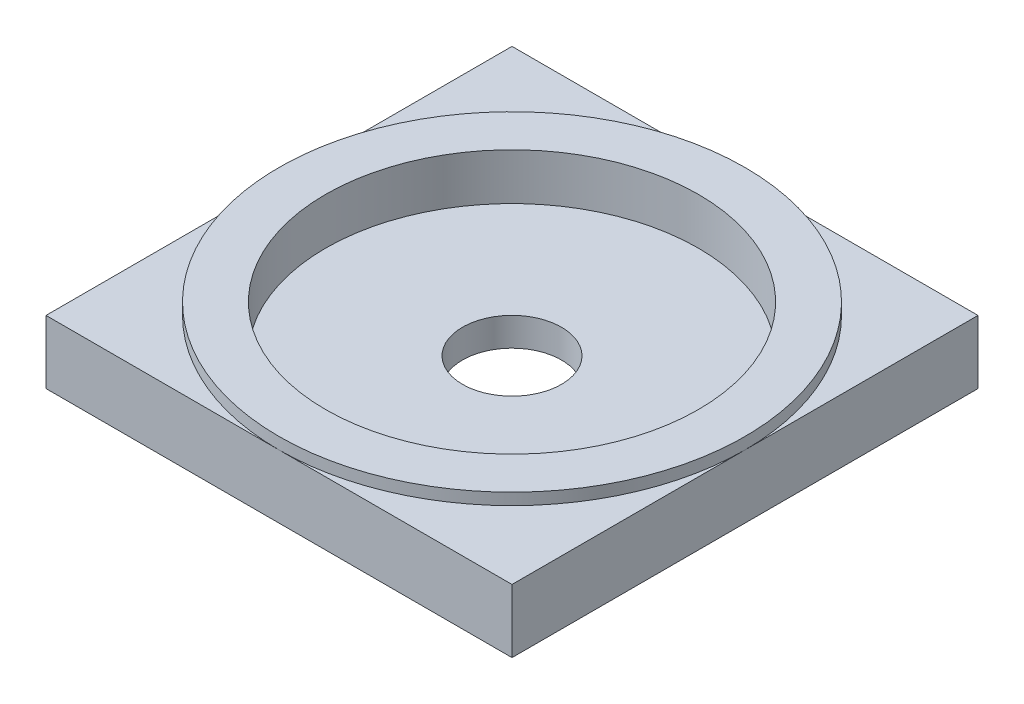
ISO-10303-21;
HEADER;
FILE_DESCRIPTION(('STEP AP214'),'2;1');
FILE_NAME('part.step','',(''),(''),'','','');
FILE_SCHEMA(('AUTOMOTIVE_DESIGN { 1 0 10303 214 1 1 1 1 }'));
ENDSEC;
DATA;
#1=APPLICATION_CONTEXT('core data for automotive mechanical design processes');
#2=APPLICATION_PROTOCOL_DEFINITION('international standard','automotive_design',2000,#1);
#3=PRODUCT_CONTEXT('',#1,'mechanical');
#4=PRODUCT('Part','Part','',(#3));
#5=PRODUCT_RELATED_PRODUCT_CATEGORY('part','',(#4));
#6=PRODUCT_DEFINITION_FORMATION('','',#4);
#7=PRODUCT_DEFINITION_CONTEXT('part definition',#1,'design');
#8=PRODUCT_DEFINITION('design','',#6,#7);
#9=PRODUCT_DEFINITION_SHAPE('','',#8);
#10=(LENGTH_UNIT() NAMED_UNIT(*) SI_UNIT(.MILLI.,.METRE.));
#11=(NAMED_UNIT(*) PLANE_ANGLE_UNIT() SI_UNIT($,.RADIAN.));
#12=(NAMED_UNIT(*) SI_UNIT($,.STERADIAN.) SOLID_ANGLE_UNIT());
#13=UNCERTAINTY_MEASURE_WITH_UNIT(LENGTH_MEASURE(1.E-05),#10,'distance_accuracy_value','');
#14=(GEOMETRIC_REPRESENTATION_CONTEXT(3) GLOBAL_UNCERTAINTY_ASSIGNED_CONTEXT((#13)) GLOBAL_UNIT_ASSIGNED_CONTEXT((#10,
#11,#12)) REPRESENTATION_CONTEXT('',''));
#15=CARTESIAN_POINT('',(0.,0.,0.));
#16=DIRECTION('',(0.,0.,1.));
#17=DIRECTION('',(1.,0.,0.));
#18=AXIS2_PLACEMENT_3D('',#15,#16,#17);
#19=CARTESIAN_POINT('',(0.,0.,0.));
#20=DIRECTION('',(0.,1.,0.));
#21=DIRECTION('',(0.,0.,1.));
#22=AXIS2_PLACEMENT_3D('',#19,#20,#21);
#23=PLANE('',#22);
#24=CARTESIAN_POINT('',(0.,0.,0.));
#25=DIRECTION('',(0.,1.,0.));
#26=DIRECTION('',(0.,0.,1.));
#27=AXIS2_PLACEMENT_3D('',#24,#25,#26);
#28=CIRCLE('',#27,31.75);
#29=CARTESIAN_POINT('',(0.,0.,31.75));
#30=VERTEX_POINT('',#29);
#31=CARTESIAN_POINT('',(31.75,0.,0.));
#32=VERTEX_POINT('',#31);
#33=EDGE_CURVE('E43',#30,#32,#28,.T.);
#34=ORIENTED_EDGE('',*,*,#33,.F.);
#35=DIRECTION('',(1.,0.,0.));
#36=VECTOR('',#35,1.);
#37=CARTESIAN_POINT('',(-31.75,0.,31.75));
#38=LINE('',#37,#36);
#39=CARTESIAN_POINT('',(31.75,0.,31.75));
#40=VERTEX_POINT('',#39);
#41=EDGE_CURVE('E93',#30,#40,#38,.T.);
#42=ORIENTED_EDGE('',*,*,#41,.T.);
#43=DIRECTION('',(0.,0.,-1.));
#44=VECTOR('',#43,1.);
#45=CARTESIAN_POINT('',(31.75,0.,-31.75));
#46=LINE('',#45,#44);
#47=EDGE_CURVE('E105',#40,#32,#46,.T.);
#48=ORIENTED_EDGE('',*,*,#47,.T.);
#49=EDGE_LOOP('',(#34,#42,#48));
#50=FACE_BOUND('',#49,.T.);
#51=ADVANCED_FACE('F32',(#50),#23,.T.);
#52=CARTESIAN_POINT('',(0.,0.,-31.75));
#53=VERTEX_POINT('',#52);
#54=EDGE_CURVE('E11',#32,#53,#28,.T.);
#55=ORIENTED_EDGE('',*,*,#54,.F.);
#56=CARTESIAN_POINT('',(31.75,0.,-31.75));
#57=VERTEX_POINT('',#56);
#58=EDGE_CURVE('E127',#32,#57,#46,.T.);
#59=ORIENTED_EDGE('',*,*,#58,.T.);
#60=DIRECTION('',(-1.,0.,0.));
#61=VECTOR('',#60,1.);
#62=CARTESIAN_POINT('',(-31.75,0.,-31.75));
#63=LINE('',#62,#61);
#64=EDGE_CURVE('E128',#57,#53,#63,.T.);
#65=ORIENTED_EDGE('',*,*,#64,.T.);
#66=EDGE_LOOP('',(#55,#59,#65));
#67=FACE_BOUND('',#66,.T.);
#68=ADVANCED_FACE('F144',(#67),#23,.T.);
#69=CARTESIAN_POINT('',(-31.75,0.,0.));
#70=VERTEX_POINT('',#69);
#71=EDGE_CURVE('E41',#53,#70,#28,.T.);
#72=ORIENTED_EDGE('',*,*,#71,.F.);
#73=CARTESIAN_POINT('',(-31.75,0.,-31.75));
#74=VERTEX_POINT('',#73);
#75=EDGE_CURVE('E126',#53,#74,#63,.T.);
#76=ORIENTED_EDGE('',*,*,#75,.T.);
#77=DIRECTION('',(0.,0.,1.));
#78=VECTOR('',#77,1.);
#79=CARTESIAN_POINT('',(-31.75,0.,-31.75));
#80=LINE('',#79,#78);
#81=EDGE_CURVE('E103',#74,#70,#80,.T.);
#82=ORIENTED_EDGE('',*,*,#81,.T.);
#83=EDGE_LOOP('',(#72,#76,#82));
#84=FACE_BOUND('',#83,.T.);
#85=ADVANCED_FACE('F161',(#84),#23,.T.);
#86=CARTESIAN_POINT('',(31.75,-8.636,-31.75));
#87=DIRECTION('',(1.,0.,0.));
#88=DIRECTION('',(0.,0.,-1.));
#89=AXIS2_PLACEMENT_3D('',#86,#87,#88);
#90=PLANE('',#89);
#91=ORIENTED_EDGE('',*,*,#47,.F.);
#92=DIRECTION('',(0.,1.,0.));
#93=VECTOR('',#92,1.);
#94=CARTESIAN_POINT('',(31.75,-8.636,31.75));
#95=LINE('',#94,#93);
#96=CARTESIAN_POINT('',(31.75,-8.636,31.75));
#97=VERTEX_POINT('',#96);
#98=EDGE_CURVE('E99',#97,#40,#95,.T.);
#99=ORIENTED_EDGE('',*,*,#98,.F.);
#100=DIRECTION('',(0.,0.,-1.));
#101=VECTOR('',#100,1.);
#102=CARTESIAN_POINT('',(31.75,-8.636,-31.75));
#103=LINE('',#102,#101);
#104=CARTESIAN_POINT('',(31.75,-8.636,-31.75));
#105=VERTEX_POINT('',#104);
#106=EDGE_CURVE('E92',#97,#105,#103,.T.);
#107=ORIENTED_EDGE('',*,*,#106,.T.);
#108=DIRECTION('',(0.,1.,0.));
#109=VECTOR('',#108,1.);
#110=CARTESIAN_POINT('',(31.75,-8.636,-31.75));
#111=LINE('',#110,#109);
#112=EDGE_CURVE('E36',#105,#57,#111,.T.);
#113=ORIENTED_EDGE('',*,*,#112,.T.);
#114=ORIENTED_EDGE('',*,*,#58,.F.);
#115=EDGE_LOOP('',(#91,#99,#107,#113,#114));
#116=FACE_BOUND('',#115,.T.);
#117=ADVANCED_FACE('F34',(#116),#90,.T.);
#118=CARTESIAN_POINT('',(-31.75,-8.636,31.75));
#119=DIRECTION('',(0.,0.,1.));
#120=DIRECTION('',(1.,0.,0.));
#121=AXIS2_PLACEMENT_3D('',#118,#119,#120);
#122=PLANE('',#121);
#123=CARTESIAN_POINT('',(-31.75,0.,31.75));
#124=VERTEX_POINT('',#123);
#125=EDGE_CURVE('E86',#124,#30,#38,.T.);
#126=ORIENTED_EDGE('',*,*,#125,.F.);
#127=DIRECTION('',(0.,1.,0.));
#128=VECTOR('',#127,1.);
#129=CARTESIAN_POINT('',(-31.75,-8.636,31.75));
#130=LINE('',#129,#128);
#131=CARTESIAN_POINT('',(-31.75,-8.636,31.75));
#132=VERTEX_POINT('',#131);
#133=EDGE_CURVE('E110',#132,#124,#130,.T.);
#134=ORIENTED_EDGE('',*,*,#133,.F.);
#135=DIRECTION('',(1.,0.,0.));
#136=VECTOR('',#135,1.);
#137=CARTESIAN_POINT('',(-31.75,-8.636,31.75));
#138=LINE('',#137,#136);
#139=EDGE_CURVE('E123',#132,#97,#138,.T.);
#140=ORIENTED_EDGE('',*,*,#139,.T.);
#141=ORIENTED_EDGE('',*,*,#98,.T.);
#142=ORIENTED_EDGE('',*,*,#41,.F.);
#143=EDGE_LOOP('',(#126,#134,#140,#141,#142));
#144=FACE_BOUND('',#143,.T.);
#145=ADVANCED_FACE('F97',(#144),#122,.T.);
#146=CARTESIAN_POINT('',(-31.75,-8.636,-31.75));
#147=DIRECTION('',(-1.,0.,0.));
#148=DIRECTION('',(0.,0.,1.));
#149=AXIS2_PLACEMENT_3D('',#146,#147,#148);
#150=PLANE('',#149);
#151=ORIENTED_EDGE('',*,*,#81,.F.);
#152=DIRECTION('',(0.,1.,0.));
#153=VECTOR('',#152,1.);
#154=CARTESIAN_POINT('',(-31.75,-8.636,-31.75));
#155=LINE('',#154,#153);
#156=CARTESIAN_POINT('',(-31.75,-8.636,-31.75));
#157=VERTEX_POINT('',#156);
#158=EDGE_CURVE('E132',#157,#74,#155,.T.);
#159=ORIENTED_EDGE('',*,*,#158,.F.);
#160=DIRECTION('',(0.,0.,1.));
#161=VECTOR('',#160,1.);
#162=CARTESIAN_POINT('',(-31.75,-8.636,-31.75));
#163=LINE('',#162,#161);
#164=EDGE_CURVE('E120',#157,#132,#163,.T.);
#165=ORIENTED_EDGE('',*,*,#164,.T.);
#166=ORIENTED_EDGE('',*,*,#133,.T.);
#167=EDGE_CURVE('E89',#70,#124,#80,.T.);
#168=ORIENTED_EDGE('',*,*,#167,.F.);
#169=EDGE_LOOP('',(#151,#159,#165,#166,#168));
#170=FACE_BOUND('',#169,.T.);
#171=ADVANCED_FACE('F170',(#170),#150,.T.);
#172=CARTESIAN_POINT('',(-31.75,-8.636,-31.75));
#173=DIRECTION('',(0.,0.,-1.));
#174=DIRECTION('',(-1.,0.,0.));
#175=AXIS2_PLACEMENT_3D('',#172,#173,#174);
#176=PLANE('',#175);
#177=ORIENTED_EDGE('',*,*,#64,.F.);
#178=ORIENTED_EDGE('',*,*,#112,.F.);
#179=DIRECTION('',(-1.,0.,0.));
#180=VECTOR('',#179,1.);
#181=CARTESIAN_POINT('',(-31.75,-8.636,-31.75));
#182=LINE('',#181,#180);
#183=EDGE_CURVE('E117',#105,#157,#182,.T.);
#184=ORIENTED_EDGE('',*,*,#183,.T.);
#185=ORIENTED_EDGE('',*,*,#158,.T.);
#186=ORIENTED_EDGE('',*,*,#75,.F.);
#187=EDGE_LOOP('',(#177,#178,#184,#185,#186));
#188=FACE_BOUND('',#187,.T.);
#189=ADVANCED_FACE('F142',(#188),#176,.T.);
#190=CARTESIAN_POINT('',(0.,-8.636,0.));
#191=DIRECTION('',(0.,1.,0.));
#192=DIRECTION('',(0.,0.,1.));
#193=AXIS2_PLACEMENT_3D('',#190,#191,#192);
#194=PLANE('',#193);
#195=CARTESIAN_POINT('',(0.,-8.636,0.));
#196=DIRECTION('',(0.,1.,0.));
#197=DIRECTION('',(0.,0.,1.));
#198=AXIS2_PLACEMENT_3D('',#195,#196,#197);
#199=CIRCLE('',#198,6.74624);
#200=CARTESIAN_POINT('',(0.,-8.636,6.74624));
#201=VERTEX_POINT('',#200);
#202=EDGE_CURVE('E183',#201,#201,#199,.T.);
#203=ORIENTED_EDGE('',*,*,#202,.T.);
#204=EDGE_LOOP('',(#203));
#205=FACE_BOUND('',#204,.T.);
#206=ORIENTED_EDGE('',*,*,#106,.F.);
#207=ORIENTED_EDGE('',*,*,#139,.F.);
#208=ORIENTED_EDGE('',*,*,#164,.F.);
#209=ORIENTED_EDGE('',*,*,#183,.F.);
#210=EDGE_LOOP('',(#206,#207,#208,#209));
#211=FACE_BOUND('',#210,.T.);
#212=ADVANCED_FACE('F159',(#205,#211),#194,.F.);
#213=EDGE_CURVE('E50',#70,#30,#28,.T.);
#214=ORIENTED_EDGE('',*,*,#213,.F.);
#215=ORIENTED_EDGE('',*,*,#167,.T.);
#216=ORIENTED_EDGE('',*,*,#125,.T.);
#217=EDGE_LOOP('',(#214,#215,#216));
#218=FACE_BOUND('',#217,.T.);
#219=ADVANCED_FACE('F88',(#218),#23,.T.);
#220=CARTESIAN_POINT('',(0.,1.5875,0.));
#221=DIRECTION('',(0.,-1.,0.));
#222=DIRECTION('',(0.,0.,-1.));
#223=AXIS2_PLACEMENT_3D('',#220,#221,#222);
#224=CYLINDRICAL_SURFACE('',#223,31.75);
#225=CARTESIAN_POINT('',(0.,1.5875,0.));
#226=DIRECTION('',(0.,1.,0.));
#227=DIRECTION('',(0.,0.,1.));
#228=AXIS2_PLACEMENT_3D('',#225,#226,#227);
#229=CIRCLE('',#228,31.75);
#230=CARTESIAN_POINT('',(0.,1.5875,31.75));
#231=VERTEX_POINT('',#230);
#232=EDGE_CURVE('E107',#231,#231,#229,.T.);
#233=ORIENTED_EDGE('',*,*,#232,.F.);
#234=EDGE_LOOP('',(#233));
#235=FACE_BOUND('',#234,.T.);
#236=ORIENTED_EDGE('',*,*,#33,.T.);
#237=ORIENTED_EDGE('',*,*,#54,.T.);
#238=ORIENTED_EDGE('',*,*,#71,.T.);
#239=ORIENTED_EDGE('',*,*,#213,.T.);
#240=EDGE_LOOP('',(#236,#237,#238,#239));
#241=FACE_BOUND('',#240,.T.);
#242=ADVANCED_FACE('F109',(#235,#241),#224,.T.);
#243=CARTESIAN_POINT('',(0.,1.5875,0.));
#244=DIRECTION('',(0.,1.,0.));
#245=DIRECTION('',(0.,0.,1.));
#246=AXIS2_PLACEMENT_3D('',#243,#244,#245);
#247=PLANE('',#246);
#248=CARTESIAN_POINT('',(0.,1.5875,0.));
#249=DIRECTION('',(0.,1.,0.));
#250=DIRECTION('',(0.,0.,1.));
#251=AXIS2_PLACEMENT_3D('',#248,#249,#250);
#252=CIRCLE('',#251,25.4);
#253=CARTESIAN_POINT('',(0.,1.5875,25.4));
#254=VERTEX_POINT('',#253);
#255=EDGE_CURVE('E264',#254,#254,#252,.T.);
#256=ORIENTED_EDGE('',*,*,#255,.F.);
#257=EDGE_LOOP('',(#256));
#258=FACE_BOUND('',#257,.T.);
#259=ORIENTED_EDGE('',*,*,#232,.T.);
#260=EDGE_LOOP('',(#259));
#261=FACE_BOUND('',#260,.T.);
#262=ADVANCED_FACE('F148',(#258,#261),#247,.T.);
#263=CARTESIAN_POINT('',(0.,-4.7625,0.));
#264=DIRECTION('',(0.,1.,0.));
#265=DIRECTION('',(0.,0.,1.));
#266=AXIS2_PLACEMENT_3D('',#263,#264,#265);
#267=CYLINDRICAL_SURFACE('',#266,25.4);
#268=CARTESIAN_POINT('',(0.,-4.7625,0.));
#269=DIRECTION('',(0.,1.,0.));
#270=DIRECTION('',(0.,0.,1.));
#271=AXIS2_PLACEMENT_3D('',#268,#269,#270);
#272=CIRCLE('',#271,25.4);
#273=CARTESIAN_POINT('',(0.,-4.7625,25.4));
#274=VERTEX_POINT('',#273);
#275=EDGE_CURVE('E108',#274,#274,#272,.T.);
#276=ORIENTED_EDGE('',*,*,#275,.F.);
#277=EDGE_LOOP('',(#276));
#278=FACE_BOUND('',#277,.T.);
#279=ORIENTED_EDGE('',*,*,#255,.T.);
#280=EDGE_LOOP('',(#279));
#281=FACE_BOUND('',#280,.T.);
#282=ADVANCED_FACE('F156',(#278,#281),#267,.F.);
#283=CARTESIAN_POINT('',(0.,-4.7625,0.));
#284=DIRECTION('',(0.,1.,0.));
#285=DIRECTION('',(0.,0.,1.));
#286=AXIS2_PLACEMENT_3D('',#283,#284,#285);
#287=PLANE('',#286);
#288=CARTESIAN_POINT('',(0.,-4.7625,0.));
#289=DIRECTION('',(0.,1.,0.));
#290=DIRECTION('',(0.,0.,1.));
#291=AXIS2_PLACEMENT_3D('',#288,#289,#290);
#292=CIRCLE('',#291,6.74624);
#293=CARTESIAN_POINT('',(0.,-4.7625,6.74624));
#294=VERTEX_POINT('',#293);
#295=EDGE_CURVE('E262',#294,#294,#292,.T.);
#296=ORIENTED_EDGE('',*,*,#295,.F.);
#297=EDGE_LOOP('',(#296));
#298=FACE_BOUND('',#297,.T.);
#299=ORIENTED_EDGE('',*,*,#275,.T.);
#300=EDGE_LOOP('',(#299));
#301=FACE_BOUND('',#300,.T.);
#302=ADVANCED_FACE('F231',(#298,#301),#287,.T.);
#303=CARTESIAN_POINT('',(0.,-8.636,0.));
#304=DIRECTION('',(0.,1.,0.));
#305=DIRECTION('',(0.,0.,1.));
#306=AXIS2_PLACEMENT_3D('',#303,#304,#305);
#307=CYLINDRICAL_SURFACE('',#306,6.74624);
#308=CARTESIAN_POINT('',(0.,-8.636,6.74624));
#309=CARTESIAN_POINT('',(0.,-8.59565104166667,6.74624));
#310=CARTESIAN_POINT('',(0.,-8.55530208333333,6.74624));
#311=CARTESIAN_POINT('',(0.,-8.47460416666667,6.74624));
#312=CARTESIAN_POINT('',(0.,-8.43425520833333,6.74624));
#313=CARTESIAN_POINT('',(0.,-8.35355729166667,6.74624));
#314=CARTESIAN_POINT('',(0.,-8.31320833333333,6.74624));
#315=CARTESIAN_POINT('',(0.,-8.23251041666667,6.74624));
#316=CARTESIAN_POINT('',(0.,-8.19216145833333,6.74624));
#317=CARTESIAN_POINT('',(0.,-8.11146354166667,6.74624));
#318=CARTESIAN_POINT('',(0.,-8.07111458333333,6.74624));
#319=CARTESIAN_POINT('',(0.,-7.99041666666667,6.74624));
#320=CARTESIAN_POINT('',(0.,-7.95006770833333,6.74624));
#321=CARTESIAN_POINT('',(0.,-7.86936979166667,6.74624));
#322=CARTESIAN_POINT('',(0.,-7.82902083333333,6.74624));
#323=CARTESIAN_POINT('',(0.,-7.74832291666667,6.74624));
#324=CARTESIAN_POINT('',(0.,-7.70797395833333,6.74624));
#325=CARTESIAN_POINT('',(0.,-7.62727604166667,6.74624));
#326=CARTESIAN_POINT('',(0.,-7.58692708333333,6.74624));
#327=CARTESIAN_POINT('',(0.,-7.50622916666667,6.74624));
#328=CARTESIAN_POINT('',(0.,-7.46588020833333,6.74624));
#329=CARTESIAN_POINT('',(0.,-7.38518229166667,6.74624));
#330=CARTESIAN_POINT('',(0.,-7.34483333333333,6.74624));
#331=CARTESIAN_POINT('',(0.,-7.26413541666667,6.74624));
#332=CARTESIAN_POINT('',(0.,-7.22378645833333,6.74624));
#333=CARTESIAN_POINT('',(0.,-7.14308854166667,6.74624));
#334=CARTESIAN_POINT('',(0.,-7.10273958333333,6.74624));
#335=CARTESIAN_POINT('',(0.,-7.02204166666667,6.74624));
#336=CARTESIAN_POINT('',(0.,-6.98169270833333,6.74624));
#337=CARTESIAN_POINT('',(0.,-6.90099479166667,6.74624));
#338=CARTESIAN_POINT('',(0.,-6.86064583333333,6.74624));
#339=CARTESIAN_POINT('',(0.,-6.77994791666667,6.74624));
#340=CARTESIAN_POINT('',(0.,-6.73959895833333,6.74624));
#341=CARTESIAN_POINT('',(0.,-6.65890104166667,6.74624));
#342=CARTESIAN_POINT('',(0.,-6.61855208333333,6.74624));
#343=CARTESIAN_POINT('',(0.,-6.53785416666667,6.74624));
#344=CARTESIAN_POINT('',(0.,-6.49750520833333,6.74624));
#345=CARTESIAN_POINT('',(0.,-6.41680729166667,6.74624));
#346=CARTESIAN_POINT('',(0.,-6.37645833333333,6.74624));
#347=CARTESIAN_POINT('',(0.,-6.29576041666667,6.74624));
#348=CARTESIAN_POINT('',(0.,-6.25541145833333,6.74624));
#349=CARTESIAN_POINT('',(0.,-6.17471354166667,6.74624));
#350=CARTESIAN_POINT('',(0.,-6.13436458333333,6.74624));
#351=CARTESIAN_POINT('',(0.,-6.05366666666667,6.74624));
#352=CARTESIAN_POINT('',(0.,-6.01331770833333,6.74624));
#353=CARTESIAN_POINT('',(0.,-5.93261979166667,6.74624));
#354=CARTESIAN_POINT('',(0.,-5.89227083333333,6.74624));
#355=CARTESIAN_POINT('',(0.,-5.81157291666667,6.74624));
#356=CARTESIAN_POINT('',(0.,-5.77122395833333,6.74624));
#357=CARTESIAN_POINT('',(0.,-5.69052604166667,6.74624));
#358=CARTESIAN_POINT('',(0.,-5.65017708333333,6.74624));
#359=CARTESIAN_POINT('',(0.,-5.56947916666667,6.74624));
#360=CARTESIAN_POINT('',(0.,-5.52913020833333,6.74624));
#361=CARTESIAN_POINT('',(0.,-5.44843229166667,6.74624));
#362=CARTESIAN_POINT('',(0.,-5.40808333333333,6.74624));
#363=CARTESIAN_POINT('',(0.,-5.32738541666667,6.74624));
#364=CARTESIAN_POINT('',(0.,-5.28703645833333,6.74624));
#365=CARTESIAN_POINT('',(0.,-5.20633854166667,6.74624));
#366=CARTESIAN_POINT('',(0.,-5.16598958333333,6.74624));
#367=CARTESIAN_POINT('',(0.,-5.08529166666667,6.74624));
#368=CARTESIAN_POINT('',(0.,-5.04494270833333,6.74624));
#369=CARTESIAN_POINT('',(0.,-4.96424479166667,6.74624));
#370=CARTESIAN_POINT('',(0.,-4.92389583333333,6.74624));
#371=CARTESIAN_POINT('',(0.,-4.84319791666667,6.74624));
#372=CARTESIAN_POINT('',(0.,-4.80284895833333,6.74624));
#373=CARTESIAN_POINT('',(0.,-4.7625,6.74624));
#374=B_SPLINE_CURVE_WITH_KNOTS('',3,(#308,#309,#310,#311,#312,#313,#314,#315,#316,#317,#318,
#319,#320,#321,#322,#323,#324,#325,#326,#327,#328,#329,#330,#331,#332,#333,#334,#335,#336,#337,
#338,#339,#340,#341,#342,#343,#344,#345,#346,#347,#348,#349,#350,#351,#352,#353,#354,#355,#356,
#357,#358,#359,#360,#361,#362,#363,#364,#365,#366,#367,#368,#369,#370,#371,#372,#373),
.UNSPECIFIED.,.F.,.F.,(4,2,2,2,2,2,2,2,2,2,2,2,2,2,2,2,2,2,2,2,2,2,2,2,2,2,2,2,2,2,2,2,4),(0.,
0.121046874999999,0.242093749999998,0.363140624999999,0.484187499999998,0.605234374999999,
0.726281249999999,0.847328125,0.968375,1.089421875,1.21046875,1.331515625,1.4525625,1.573609375,
1.69465625,1.815703125,1.93675,2.057796875,2.17884375,2.299890625,2.4209375,2.541984375,
2.66303125,2.784078125,2.905125,3.026171875,3.14721875,3.268265625,3.3893125,3.510359375,
3.63140625,3.752453125,3.8735),.UNSPECIFIED.);
#375=EDGE_CURVE('BSEAM245',#201,#294,#374,.T.);
#376=ORIENTED_EDGE('',*,*,#202,.F.);
#377=ORIENTED_EDGE('',*,*,#295,.T.);
#378=ORIENTED_EDGE('',*,*,#375,.T.);
#379=ORIENTED_EDGE('',*,*,#375,.F.);
#380=EDGE_LOOP('',(#376,#378,#377,#379));
#381=FACE_BOUND('',#380,.T.);
#382=ADVANCED_FACE('F245',(#381),#307,.F.);
#383=CLOSED_SHELL('',(#51,#68,#85,#117,#145,#171,#189,#212,#219,#242,#262,#282,#302,#382));
#384=MANIFOLD_SOLID_BREP('B2',#383);
#385=ADVANCED_BREP_SHAPE_REPRESENTATION('',(#18,#384),#14);
#386=SHAPE_DEFINITION_REPRESENTATION(#9,#385);
ENDSEC;
END-ISO-10303-21;
